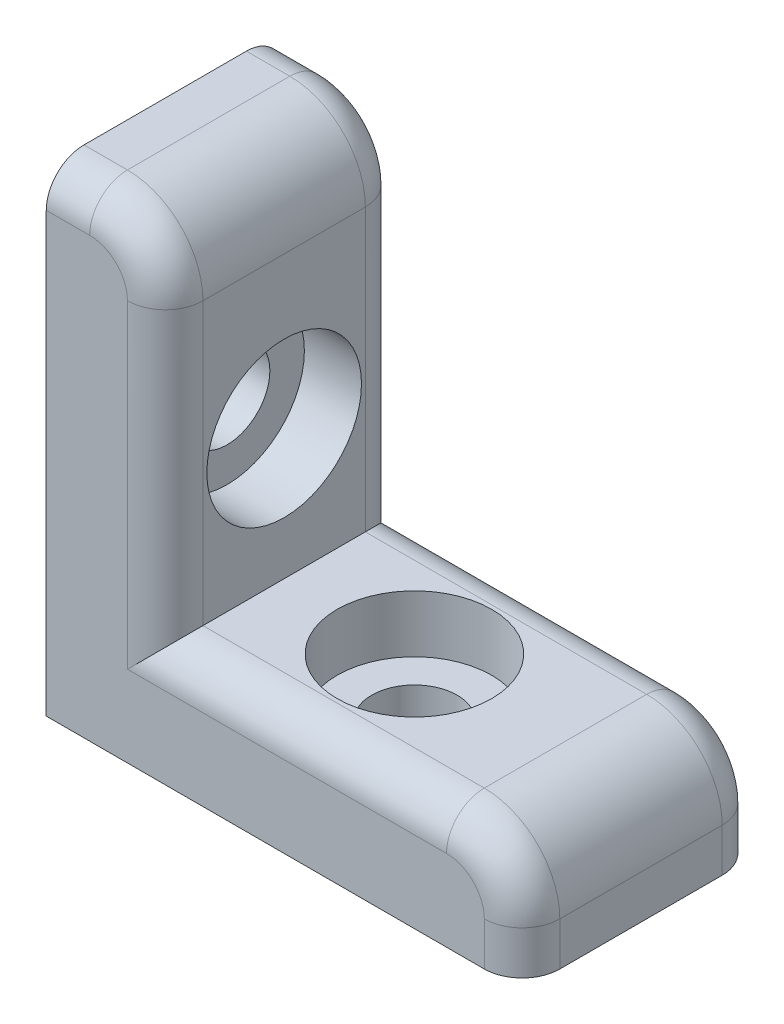
ISO-10303-21;
HEADER;
FILE_DESCRIPTION(('STEP AP214'),'2;1');
FILE_NAME('part.step','',(''),(''),'','','');
FILE_SCHEMA(('AUTOMOTIVE_DESIGN { 1 0 10303 214 1 1 1 1 }'));
ENDSEC;
DATA;
#1=APPLICATION_CONTEXT('core data for automotive mechanical design processes');
#2=APPLICATION_PROTOCOL_DEFINITION('international standard','automotive_design',2000,#1);
#3=PRODUCT_CONTEXT('',#1,'mechanical');
#4=PRODUCT('Part','Part','',(#3));
#5=PRODUCT_RELATED_PRODUCT_CATEGORY('part','',(#4));
#6=PRODUCT_DEFINITION_FORMATION('','',#4);
#7=PRODUCT_DEFINITION_CONTEXT('part definition',#1,'design');
#8=PRODUCT_DEFINITION('design','',#6,#7);
#9=PRODUCT_DEFINITION_SHAPE('','',#8);
#10=(LENGTH_UNIT() NAMED_UNIT(*) SI_UNIT(.MILLI.,.METRE.));
#11=(NAMED_UNIT(*) PLANE_ANGLE_UNIT() SI_UNIT($,.RADIAN.));
#12=(NAMED_UNIT(*) SI_UNIT($,.STERADIAN.) SOLID_ANGLE_UNIT());
#13=UNCERTAINTY_MEASURE_WITH_UNIT(LENGTH_MEASURE(1.E-05),#10,'distance_accuracy_value','');
#14=(GEOMETRIC_REPRESENTATION_CONTEXT(3) GLOBAL_UNCERTAINTY_ASSIGNED_CONTEXT((#13)) GLOBAL_UNIT_ASSIGNED_CONTEXT((#10,
#11,#12)) REPRESENTATION_CONTEXT('',''));
#15=CARTESIAN_POINT('',(0.,0.,0.));
#16=DIRECTION('',(0.,0.,1.));
#17=DIRECTION('',(1.,0.,0.));
#18=AXIS2_PLACEMENT_3D('',#15,#16,#17);
#19=CARTESIAN_POINT('',(0.,20.,5.));
#20=DIRECTION('',(1.,0.,0.));
#21=DIRECTION('',(0.,0.,-1.));
#22=AXIS2_PLACEMENT_3D('',#19,#20,#21);
#23=PLANE('',#22);
#24=CARTESIAN_POINT('',(0.,10.475,0.));
#25=DIRECTION('',(1.,0.,0.));
#26=DIRECTION('',(0.,0.,-1.));
#27=AXIS2_PLACEMENT_3D('',#24,#25,#26);
#28=CIRCLE('',#27,1.80000000000001);
#29=CARTESIAN_POINT('',(0.,10.475,-1.80000000000001));
#30=VERTEX_POINT('',#29);
#31=EDGE_CURVE('E346',#30,#30,#28,.T.);
#32=ORIENTED_EDGE('',*,*,#31,.T.);
#33=EDGE_LOOP('',(#32));
#34=FACE_BOUND('',#33,.T.);
#35=DIRECTION('',(0.,0.,-1.));
#36=VECTOR('',#35,1.);
#37=CARTESIAN_POINT('',(0.,20.,5.));
#38=LINE('',#37,#36);
#39=CARTESIAN_POINT('',(0.,20.,3.4125));
#40=VERTEX_POINT('',#39);
#41=CARTESIAN_POINT('',(0.,20.,-3.4125));
#42=VERTEX_POINT('',#41);
#43=EDGE_CURVE('E178',#40,#42,#38,.T.);
#44=ORIENTED_EDGE('',*,*,#43,.T.);
#45=CARTESIAN_POINT('',(0.,18.4125,-3.4125));
#46=DIRECTION('',(1.,0.,0.));
#47=DIRECTION('',(0.,0.,-1.));
#48=AXIS2_PLACEMENT_3D('',#45,#46,#47);
#49=CIRCLE('',#48,1.5875);
#50=CARTESIAN_POINT('',(0.,18.4125,-5.));
#51=VERTEX_POINT('',#50);
#52=EDGE_CURVE('E254',#42,#51,#49,.F.);
#53=ORIENTED_EDGE('',*,*,#52,.T.);
#54=DIRECTION('',(0.,-1.,0.));
#55=VECTOR('',#54,1.);
#56=CARTESIAN_POINT('',(0.,20.,-5.));
#57=LINE('',#56,#55);
#58=CARTESIAN_POINT('',(0.,0.,-5.));
#59=VERTEX_POINT('',#58);
#60=EDGE_CURVE('E182',#51,#59,#57,.T.);
#61=ORIENTED_EDGE('',*,*,#60,.T.);
#62=DIRECTION('',(0.,0.,-1.));
#63=VECTOR('',#62,1.);
#64=CARTESIAN_POINT('',(0.,0.,5.));
#65=LINE('',#64,#63);
#66=CARTESIAN_POINT('',(0.,0.,5.));
#67=VERTEX_POINT('',#66);
#68=EDGE_CURVE('E173',#67,#59,#65,.T.);
#69=ORIENTED_EDGE('',*,*,#68,.F.);
#70=DIRECTION('',(0.,-1.,0.));
#71=VECTOR('',#70,1.);
#72=CARTESIAN_POINT('',(0.,20.,5.));
#73=LINE('',#72,#71);
#74=CARTESIAN_POINT('',(0.,18.4125,5.));
#75=VERTEX_POINT('',#74);
#76=EDGE_CURVE('E157',#75,#67,#73,.T.);
#77=ORIENTED_EDGE('',*,*,#76,.F.);
#78=CARTESIAN_POINT('',(0.,18.4125,3.4125));
#79=DIRECTION('',(1.,0.,0.));
#80=DIRECTION('',(0.,0.,-1.));
#81=AXIS2_PLACEMENT_3D('',#78,#79,#80);
#82=CIRCLE('',#81,1.5875);
#83=EDGE_CURVE('E251',#75,#40,#82,.F.);
#84=ORIENTED_EDGE('',*,*,#83,.T.);
#85=EDGE_LOOP('',(#44,#53,#61,#69,#77,#84));
#86=FACE_BOUND('',#85,.T.);
#87=ADVANCED_FACE('F47',(#34,#86),#23,.F.);
#88=CARTESIAN_POINT('',(0.,0.,5.));
#89=DIRECTION('',(0.,1.,0.));
#90=DIRECTION('',(0.,0.,1.));
#91=AXIS2_PLACEMENT_3D('',#88,#89,#90);
#92=PLANE('',#91);
#93=CARTESIAN_POINT('',(10.475,0.,0.));
#94=DIRECTION('',(0.,1.,0.));
#95=DIRECTION('',(0.,0.,1.));
#96=AXIS2_PLACEMENT_3D('',#93,#94,#95);
#97=CIRCLE('',#96,1.80000000000001);
#98=CARTESIAN_POINT('',(10.475,0.,1.80000000000001));
#99=VERTEX_POINT('',#98);
#100=EDGE_CURVE('E363',#99,#99,#97,.T.);
#101=ORIENTED_EDGE('',*,*,#100,.T.);
#102=EDGE_LOOP('',(#101));
#103=FACE_BOUND('',#102,.T.);
#104=DIRECTION('',(1.,0.,0.));
#105=VECTOR('',#104,1.);
#106=CARTESIAN_POINT('',(0.,0.,-5.));
#107=LINE('',#106,#105);
#108=CARTESIAN_POINT('',(18.4125,0.,-5.));
#109=VERTEX_POINT('',#108);
#110=EDGE_CURVE('E167',#59,#109,#107,.T.);
#111=ORIENTED_EDGE('',*,*,#110,.T.);
#112=CARTESIAN_POINT('',(18.4125,0.,-3.4125));
#113=DIRECTION('',(0.,1.,0.));
#114=DIRECTION('',(0.,0.,1.));
#115=AXIS2_PLACEMENT_3D('',#112,#113,#114);
#116=CIRCLE('',#115,1.5875);
#117=CARTESIAN_POINT('',(20.,0.,-3.4125));
#118=VERTEX_POINT('',#117);
#119=EDGE_CURVE('E242',#109,#118,#116,.F.);
#120=ORIENTED_EDGE('',*,*,#119,.T.);
#121=DIRECTION('',(0.,0.,-1.));
#122=VECTOR('',#121,1.);
#123=CARTESIAN_POINT('',(20.,0.,5.));
#124=LINE('',#123,#122);
#125=CARTESIAN_POINT('',(20.,0.,3.4125));
#126=VERTEX_POINT('',#125);
#127=EDGE_CURVE('E186',#126,#118,#124,.T.);
#128=ORIENTED_EDGE('',*,*,#127,.F.);
#129=CARTESIAN_POINT('',(18.4125,0.,3.4125));
#130=DIRECTION('',(0.,1.,0.));
#131=DIRECTION('',(0.,0.,1.));
#132=AXIS2_PLACEMENT_3D('',#129,#130,#131);
#133=CIRCLE('',#132,1.5875);
#134=CARTESIAN_POINT('',(18.4125,0.,5.));
#135=VERTEX_POINT('',#134);
#136=EDGE_CURVE('E176',#126,#135,#133,.F.);
#137=ORIENTED_EDGE('',*,*,#136,.T.);
#138=DIRECTION('',(1.,0.,0.));
#139=VECTOR('',#138,1.);
#140=CARTESIAN_POINT('',(0.,0.,5.));
#141=LINE('',#140,#139);
#142=EDGE_CURVE('E160',#67,#135,#141,.T.);
#143=ORIENTED_EDGE('',*,*,#142,.F.);
#144=ORIENTED_EDGE('',*,*,#68,.T.);
#145=EDGE_LOOP('',(#111,#120,#128,#137,#143,#144));
#146=FACE_BOUND('',#145,.T.);
#147=ADVANCED_FACE('F172',(#103,#146),#92,.F.);
#148=CARTESIAN_POINT('',(20.,5.,5.));
#149=DIRECTION('',(-1.,0.,0.));
#150=DIRECTION('',(0.,0.,1.));
#151=AXIS2_PLACEMENT_3D('',#148,#149,#150);
#152=PLANE('',#151);
#153=ORIENTED_EDGE('',*,*,#127,.T.);
#154=DIRECTION('',(0.,1.,0.));
#155=VECTOR('',#154,1.);
#156=CARTESIAN_POINT('',(20.,5.,-3.4125));
#157=LINE('',#156,#155);
#158=CARTESIAN_POINT('',(20.,1.825,-3.4125));
#159=VERTEX_POINT('',#158);
#160=EDGE_CURVE('E237',#118,#159,#157,.T.);
#161=ORIENTED_EDGE('',*,*,#160,.T.);
#162=DIRECTION('',(0.,0.,-1.));
#163=VECTOR('',#162,1.);
#164=CARTESIAN_POINT('',(20.,1.825,5.));
#165=LINE('',#164,#163);
#166=CARTESIAN_POINT('',(20.,1.825,3.4125));
#167=VERTEX_POINT('',#166);
#168=EDGE_CURVE('E191',#159,#167,#165,.F.);
#169=ORIENTED_EDGE('',*,*,#168,.T.);
#170=DIRECTION('',(0.,1.,0.));
#171=VECTOR('',#170,1.);
#172=CARTESIAN_POINT('',(20.,0.,3.4125));
#173=LINE('',#172,#171);
#174=EDGE_CURVE('E234',#167,#126,#173,.F.);
#175=ORIENTED_EDGE('',*,*,#174,.T.);
#176=EDGE_LOOP('',(#153,#161,#169,#175));
#177=FACE_BOUND('',#176,.T.);
#178=ADVANCED_FACE('F385',(#177),#152,.F.);
#179=CARTESIAN_POINT('',(5.,5.,5.));
#180=DIRECTION('',(0.,-1.,0.));
#181=DIRECTION('',(0.,0.,-1.));
#182=AXIS2_PLACEMENT_3D('',#179,#180,#181);
#183=PLANE('',#182);
#184=CARTESIAN_POINT('',(10.475,5.,0.));
#185=DIRECTION('',(0.,1.,0.));
#186=DIRECTION('',(0.,0.,1.));
#187=AXIS2_PLACEMENT_3D('',#184,#185,#186);
#188=CIRCLE('',#187,3.25);
#189=CARTESIAN_POINT('',(10.475,5.,3.25));
#190=VERTEX_POINT('',#189);
#191=EDGE_CURVE('E306',#190,#190,#188,.T.);
#192=ORIENTED_EDGE('',*,*,#191,.F.);
#193=EDGE_LOOP('',(#192));
#194=FACE_BOUND('',#193,.T.);
#195=DIRECTION('',(0.,0.,-1.));
#196=VECTOR('',#195,1.);
#197=CARTESIAN_POINT('',(16.825,5.,5.));
#198=LINE('',#197,#196);
#199=CARTESIAN_POINT('',(16.825,5.,3.4125));
#200=VERTEX_POINT('',#199);
#201=CARTESIAN_POINT('',(16.825,5.,-3.4125));
#202=VERTEX_POINT('',#201);
#203=EDGE_CURVE('E185',#200,#202,#198,.T.);
#204=ORIENTED_EDGE('',*,*,#203,.T.);
#205=DIRECTION('',(-1.,0.,0.));
#206=VECTOR('',#205,1.);
#207=CARTESIAN_POINT('',(5.,5.,-3.4125));
#208=LINE('',#207,#206);
#209=CARTESIAN_POINT('',(5.,5.,-3.4125));
#210=VERTEX_POINT('',#209);
#211=EDGE_CURVE('E212',#202,#210,#208,.T.);
#212=ORIENTED_EDGE('',*,*,#211,.T.);
#213=DIRECTION('',(0.,0.,-1.));
#214=VECTOR('',#213,1.);
#215=CARTESIAN_POINT('',(5.,5.,5.));
#216=LINE('',#215,#214);
#217=CARTESIAN_POINT('',(5.,5.,3.4125));
#218=VERTEX_POINT('',#217);
#219=EDGE_CURVE('E194',#218,#210,#216,.T.);
#220=ORIENTED_EDGE('',*,*,#219,.F.);
#221=DIRECTION('',(-1.,0.,0.));
#222=VECTOR('',#221,1.);
#223=CARTESIAN_POINT('',(16.825,5.,3.4125));
#224=LINE('',#223,#222);
#225=EDGE_CURVE('E209',#218,#200,#224,.F.);
#226=ORIENTED_EDGE('',*,*,#225,.T.);
#227=EDGE_LOOP('',(#204,#212,#220,#226));
#228=FACE_BOUND('',#227,.T.);
#229=ADVANCED_FACE('F381',(#194,#228),#183,.F.);
#230=CARTESIAN_POINT('',(5.,20.,5.));
#231=DIRECTION('',(-1.,0.,0.));
#232=DIRECTION('',(0.,-1.,0.));
#233=AXIS2_PLACEMENT_3D('',#230,#231,#232);
#234=PLANE('',#233);
#235=CARTESIAN_POINT('',(5.,10.475,0.));
#236=DIRECTION('',(1.,0.,0.));
#237=DIRECTION('',(0.,0.,-1.));
#238=AXIS2_PLACEMENT_3D('',#235,#236,#237);
#239=CIRCLE('',#238,3.25);
#240=CARTESIAN_POINT('',(5.,10.475,-3.25));
#241=VERTEX_POINT('',#240);
#242=EDGE_CURVE('E359',#241,#241,#239,.T.);
#243=ORIENTED_EDGE('',*,*,#242,.F.);
#244=EDGE_LOOP('',(#243));
#245=FACE_BOUND('',#244,.T.);
#246=ORIENTED_EDGE('',*,*,#219,.T.);
#247=DIRECTION('',(0.,1.,0.));
#248=VECTOR('',#247,1.);
#249=CARTESIAN_POINT('',(5.,20.,-3.4125));
#250=LINE('',#249,#248);
#251=CARTESIAN_POINT('',(5.,16.825,-3.4125));
#252=VERTEX_POINT('',#251);
#253=EDGE_CURVE('E260',#210,#252,#250,.T.);
#254=ORIENTED_EDGE('',*,*,#253,.T.);
#255=DIRECTION('',(0.,0.,-1.));
#256=VECTOR('',#255,1.);
#257=CARTESIAN_POINT('',(5.,16.825,5.));
#258=LINE('',#257,#256);
#259=CARTESIAN_POINT('',(5.,16.825,3.4125));
#260=VERTEX_POINT('',#259);
#261=EDGE_CURVE('E205',#252,#260,#258,.F.);
#262=ORIENTED_EDGE('',*,*,#261,.T.);
#263=DIRECTION('',(0.,1.,0.));
#264=VECTOR('',#263,1.);
#265=CARTESIAN_POINT('',(5.,5.,3.4125));
#266=LINE('',#265,#264);
#267=EDGE_CURVE('E257',#260,#218,#266,.F.);
#268=ORIENTED_EDGE('',*,*,#267,.T.);
#269=EDGE_LOOP('',(#246,#254,#262,#268));
#270=FACE_BOUND('',#269,.T.);
#271=ADVANCED_FACE('F384',(#245,#270),#234,.F.);
#272=CARTESIAN_POINT('',(0.,20.,5.));
#273=DIRECTION('',(0.,-1.,0.));
#274=DIRECTION('',(0.,0.,-1.));
#275=AXIS2_PLACEMENT_3D('',#272,#273,#274);
#276=PLANE('',#275);
#277=DIRECTION('',(0.,0.,-1.));
#278=VECTOR('',#277,1.);
#279=CARTESIAN_POINT('',(1.825,20.,5.));
#280=LINE('',#279,#278);
#281=CARTESIAN_POINT('',(1.825,20.,3.4125));
#282=VERTEX_POINT('',#281);
#283=CARTESIAN_POINT('',(1.825,20.,-3.4125));
#284=VERTEX_POINT('',#283);
#285=EDGE_CURVE('E201',#282,#284,#280,.T.);
#286=ORIENTED_EDGE('',*,*,#285,.T.);
#287=DIRECTION('',(-1.,0.,0.));
#288=VECTOR('',#287,1.);
#289=CARTESIAN_POINT('',(0.,20.,-3.4125));
#290=LINE('',#289,#288);
#291=EDGE_CURVE('E248',#284,#42,#290,.T.);
#292=ORIENTED_EDGE('',*,*,#291,.T.);
#293=ORIENTED_EDGE('',*,*,#43,.F.);
#294=DIRECTION('',(-1.,0.,0.));
#295=VECTOR('',#294,1.);
#296=CARTESIAN_POINT('',(1.825,20.,3.4125));
#297=LINE('',#296,#295);
#298=EDGE_CURVE('E245',#40,#282,#297,.F.);
#299=ORIENTED_EDGE('',*,*,#298,.T.);
#300=EDGE_LOOP('',(#286,#292,#293,#299));
#301=FACE_BOUND('',#300,.T.);
#302=ADVANCED_FACE('F335',(#301),#276,.F.);
#303=CARTESIAN_POINT('',(0.,0.,5.));
#304=DIRECTION('',(0.,0.,1.));
#305=DIRECTION('',(1.,0.,0.));
#306=AXIS2_PLACEMENT_3D('',#303,#304,#305);
#307=PLANE('',#306);
#308=ORIENTED_EDGE('',*,*,#142,.T.);
#309=DIRECTION('',(0.,1.,0.));
#310=VECTOR('',#309,1.);
#311=CARTESIAN_POINT('',(18.4125,1.825,5.));
#312=LINE('',#311,#310);
#313=CARTESIAN_POINT('',(18.4125,1.825,5.));
#314=VERTEX_POINT('',#313);
#315=EDGE_CURVE('E276',#135,#314,#312,.T.);
#316=ORIENTED_EDGE('',*,*,#315,.T.);
#317=CARTESIAN_POINT('',(16.825,1.825,5.));
#318=DIRECTION('',(0.,0.,1.));
#319=DIRECTION('',(1.,0.,0.));
#320=AXIS2_PLACEMENT_3D('',#317,#318,#319);
#321=CIRCLE('',#320,1.5875);
#322=CARTESIAN_POINT('',(16.825,3.4125,5.));
#323=VERTEX_POINT('',#322);
#324=EDGE_CURVE('E72',#314,#323,#321,.T.);
#325=ORIENTED_EDGE('',*,*,#324,.T.);
#326=DIRECTION('',(-1.,0.,0.));
#327=VECTOR('',#326,1.);
#328=CARTESIAN_POINT('',(5.,3.4125,5.));
#329=LINE('',#328,#327);
#330=CARTESIAN_POINT('',(3.4125,3.4125,5.));
#331=VERTEX_POINT('',#330);
#332=EDGE_CURVE('E271',#323,#331,#329,.T.);
#333=ORIENTED_EDGE('',*,*,#332,.T.);
#334=DIRECTION('',(0.,1.,0.));
#335=VECTOR('',#334,1.);
#336=CARTESIAN_POINT('',(3.4125,16.825,5.));
#337=LINE('',#336,#335);
#338=CARTESIAN_POINT('',(3.4125,16.825,5.));
#339=VERTEX_POINT('',#338);
#340=EDGE_CURVE('E268',#331,#339,#337,.T.);
#341=ORIENTED_EDGE('',*,*,#340,.T.);
#342=CARTESIAN_POINT('',(1.825,16.825,5.));
#343=DIRECTION('',(0.,0.,1.));
#344=DIRECTION('',(1.,0.,0.));
#345=AXIS2_PLACEMENT_3D('',#342,#343,#344);
#346=CIRCLE('',#345,1.5875);
#347=CARTESIAN_POINT('',(1.825,18.4125,5.));
#348=VERTEX_POINT('',#347);
#349=EDGE_CURVE('E263',#339,#348,#346,.T.);
#350=ORIENTED_EDGE('',*,*,#349,.T.);
#351=DIRECTION('',(-1.,0.,0.));
#352=VECTOR('',#351,1.);
#353=CARTESIAN_POINT('',(0.,18.4125,5.));
#354=LINE('',#353,#352);
#355=EDGE_CURVE('E162',#348,#75,#354,.T.);
#356=ORIENTED_EDGE('',*,*,#355,.T.);
#357=ORIENTED_EDGE('',*,*,#76,.T.);
#358=EDGE_LOOP('',(#308,#316,#325,#333,#341,#350,#356,#357));
#359=FACE_BOUND('',#358,.T.);
#360=ADVANCED_FACE('F159',(#359),#307,.T.);
#361=CARTESIAN_POINT('',(0.,0.,-5.));
#362=DIRECTION('',(0.,0.,1.));
#363=DIRECTION('',(1.,0.,0.));
#364=AXIS2_PLACEMENT_3D('',#361,#362,#363);
#365=PLANE('',#364);
#366=CARTESIAN_POINT('',(16.825,1.825,-5.));
#367=DIRECTION('',(0.,0.,1.));
#368=DIRECTION('',(1.,0.,0.));
#369=AXIS2_PLACEMENT_3D('',#366,#367,#368);
#370=CIRCLE('',#369,1.5875);
#371=CARTESIAN_POINT('',(16.825,3.4125,-5.));
#372=VERTEX_POINT('',#371);
#373=CARTESIAN_POINT('',(18.4125,1.825,-5.));
#374=VERTEX_POINT('',#373);
#375=EDGE_CURVE('E228',#372,#374,#370,.F.);
#376=ORIENTED_EDGE('',*,*,#375,.T.);
#377=DIRECTION('',(0.,1.,0.));
#378=VECTOR('',#377,1.);
#379=CARTESIAN_POINT('',(18.4125,0.,-5.));
#380=LINE('',#379,#378);
#381=EDGE_CURVE('E231',#374,#109,#380,.F.);
#382=ORIENTED_EDGE('',*,*,#381,.T.);
#383=ORIENTED_EDGE('',*,*,#110,.F.);
#384=ORIENTED_EDGE('',*,*,#60,.F.);
#385=DIRECTION('',(-1.,0.,0.));
#386=VECTOR('',#385,1.);
#387=CARTESIAN_POINT('',(0.,18.4125,-5.));
#388=LINE('',#387,#386);
#389=CARTESIAN_POINT('',(1.825,18.4125,-5.));
#390=VERTEX_POINT('',#389);
#391=EDGE_CURVE('E222',#51,#390,#388,.F.);
#392=ORIENTED_EDGE('',*,*,#391,.T.);
#393=CARTESIAN_POINT('',(1.825,16.825,-5.));
#394=DIRECTION('',(0.,0.,1.));
#395=DIRECTION('',(1.,0.,0.));
#396=AXIS2_PLACEMENT_3D('',#393,#394,#395);
#397=CIRCLE('',#396,1.5875);
#398=CARTESIAN_POINT('',(3.4125,16.825,-5.));
#399=VERTEX_POINT('',#398);
#400=EDGE_CURVE('E216',#390,#399,#397,.F.);
#401=ORIENTED_EDGE('',*,*,#400,.T.);
#402=DIRECTION('',(0.,1.,0.));
#403=VECTOR('',#402,1.);
#404=CARTESIAN_POINT('',(3.4125,0.,-5.));
#405=LINE('',#404,#403);
#406=CARTESIAN_POINT('',(3.4125,3.4125,-5.));
#407=VERTEX_POINT('',#406);
#408=EDGE_CURVE('E219',#399,#407,#405,.F.);
#409=ORIENTED_EDGE('',*,*,#408,.T.);
#410=DIRECTION('',(-1.,0.,0.));
#411=VECTOR('',#410,1.);
#412=CARTESIAN_POINT('',(0.,3.4125,-5.));
#413=LINE('',#412,#411);
#414=EDGE_CURVE('E225',#407,#372,#413,.F.);
#415=ORIENTED_EDGE('',*,*,#414,.T.);
#416=EDGE_LOOP('',(#376,#382,#383,#384,#392,#401,#409,#415));
#417=FACE_BOUND('',#416,.T.);
#418=ADVANCED_FACE('F420',(#417),#365,.F.);
#419=CARTESIAN_POINT('',(5.,10.475,0.));
#420=DIRECTION('',(1.,0.,0.));
#421=DIRECTION('',(0.,0.,-1.));
#422=AXIS2_PLACEMENT_3D('',#419,#420,#421);
#423=CYLINDRICAL_SURFACE('',#422,1.80000000000001);
#424=ORIENTED_EDGE('',*,*,#31,.F.);
#425=EDGE_LOOP('',(#424));
#426=FACE_BOUND('',#425,.T.);
#427=CARTESIAN_POINT('',(2.6,10.475,0.));
#428=DIRECTION('',(1.,0.,0.));
#429=DIRECTION('',(0.,0.,-1.));
#430=AXIS2_PLACEMENT_3D('',#427,#428,#429);
#431=CIRCLE('',#430,1.8);
#432=CARTESIAN_POINT('',(2.6,10.475,-1.8));
#433=VERTEX_POINT('',#432);
#434=EDGE_CURVE('E351',#433,#433,#431,.T.);
#435=ORIENTED_EDGE('',*,*,#434,.T.);
#436=EDGE_LOOP('',(#435));
#437=FACE_BOUND('',#436,.T.);
#438=ADVANCED_FACE('F604',(#426,#437),#423,.F.);
#439=CARTESIAN_POINT('',(2.6,12.275,0.));
#440=DIRECTION('',(-1.,0.,0.));
#441=DIRECTION('',(0.,0.,1.));
#442=AXIS2_PLACEMENT_3D('',#439,#440,#441);
#443=PLANE('',#442);
#444=ORIENTED_EDGE('',*,*,#434,.F.);
#445=EDGE_LOOP('',(#444));
#446=FACE_BOUND('',#445,.T.);
#447=CARTESIAN_POINT('',(2.6,10.475,0.));
#448=DIRECTION('',(1.,0.,0.));
#449=DIRECTION('',(0.,0.,-1.));
#450=AXIS2_PLACEMENT_3D('',#447,#448,#449);
#451=CIRCLE('',#450,3.25);
#452=CARTESIAN_POINT('',(2.6,10.475,-3.25));
#453=VERTEX_POINT('',#452);
#454=EDGE_CURVE('E355',#453,#453,#451,.T.);
#455=ORIENTED_EDGE('',*,*,#454,.T.);
#456=EDGE_LOOP('',(#455));
#457=FACE_BOUND('',#456,.T.);
#458=ADVANCED_FACE('F595',(#446,#457),#443,.F.);
#459=CARTESIAN_POINT('',(5.,10.475,0.));
#460=DIRECTION('',(1.,0.,0.));
#461=DIRECTION('',(0.,0.,-1.));
#462=AXIS2_PLACEMENT_3D('',#459,#460,#461);
#463=CYLINDRICAL_SURFACE('',#462,3.25);
#464=ORIENTED_EDGE('',*,*,#454,.F.);
#465=EDGE_LOOP('',(#464));
#466=FACE_BOUND('',#465,.T.);
#467=ORIENTED_EDGE('',*,*,#242,.T.);
#468=EDGE_LOOP('',(#467));
#469=FACE_BOUND('',#468,.T.);
#470=ADVANCED_FACE('F586',(#466,#469),#463,.F.);
#471=CARTESIAN_POINT('',(10.475,5.,0.));
#472=DIRECTION('',(0.,1.,0.));
#473=DIRECTION('',(0.,0.,1.));
#474=AXIS2_PLACEMENT_3D('',#471,#472,#473);
#475=CYLINDRICAL_SURFACE('',#474,1.80000000000001);
#476=ORIENTED_EDGE('',*,*,#100,.F.);
#477=EDGE_LOOP('',(#476));
#478=FACE_BOUND('',#477,.T.);
#479=CARTESIAN_POINT('',(10.475,2.6,0.));
#480=DIRECTION('',(0.,1.,0.));
#481=DIRECTION('',(0.,0.,1.));
#482=AXIS2_PLACEMENT_3D('',#479,#480,#481);
#483=CIRCLE('',#482,1.80000000000001);
#484=CARTESIAN_POINT('',(10.475,2.6,1.80000000000001));
#485=VERTEX_POINT('',#484);
#486=EDGE_CURVE('E367',#485,#485,#483,.T.);
#487=ORIENTED_EDGE('',*,*,#486,.T.);
#488=EDGE_LOOP('',(#487));
#489=FACE_BOUND('',#488,.T.);
#490=ADVANCED_FACE('F577',(#478,#489),#475,.F.);
#491=CARTESIAN_POINT('',(12.275,2.6,0.));
#492=DIRECTION('',(0.,-1.,0.));
#493=DIRECTION('',(0.,0.,-1.));
#494=AXIS2_PLACEMENT_3D('',#491,#492,#493);
#495=PLANE('',#494);
#496=ORIENTED_EDGE('',*,*,#486,.F.);
#497=EDGE_LOOP('',(#496));
#498=FACE_BOUND('',#497,.T.);
#499=CARTESIAN_POINT('',(10.475,2.6,0.));
#500=DIRECTION('',(0.,1.,0.));
#501=DIRECTION('',(0.,0.,1.));
#502=AXIS2_PLACEMENT_3D('',#499,#500,#501);
#503=CIRCLE('',#502,3.25);
#504=CARTESIAN_POINT('',(10.475,2.6,3.25));
#505=VERTEX_POINT('',#504);
#506=EDGE_CURVE('E371',#505,#505,#503,.T.);
#507=ORIENTED_EDGE('',*,*,#506,.T.);
#508=EDGE_LOOP('',(#507));
#509=FACE_BOUND('',#508,.T.);
#510=ADVANCED_FACE('F568',(#498,#509),#495,.F.);
#511=CARTESIAN_POINT('',(10.475,5.,0.));
#512=DIRECTION('',(0.,1.,0.));
#513=DIRECTION('',(0.,0.,1.));
#514=AXIS2_PLACEMENT_3D('',#511,#512,#513);
#515=CYLINDRICAL_SURFACE('',#514,3.25);
#516=ORIENTED_EDGE('',*,*,#506,.F.);
#517=EDGE_LOOP('',(#516));
#518=FACE_BOUND('',#517,.T.);
#519=ORIENTED_EDGE('',*,*,#191,.T.);
#520=EDGE_LOOP('',(#519));
#521=FACE_BOUND('',#520,.T.);
#522=ADVANCED_FACE('F379',(#518,#521),#515,.F.);
#523=CARTESIAN_POINT('',(16.825,1.825,5.));
#524=DIRECTION('',(0.,0.,-1.));
#525=DIRECTION('',(-1.,0.,0.));
#526=AXIS2_PLACEMENT_3D('',#523,#524,#525);
#527=CYLINDRICAL_SURFACE('',#526,3.175);
#528=ORIENTED_EDGE('',*,*,#168,.F.);
#529=CARTESIAN_POINT('',(16.825,1.825,-3.4125));
#530=DIRECTION('',(0.,0.,1.));
#531=DIRECTION('',(1.,0.,0.));
#532=AXIS2_PLACEMENT_3D('',#529,#530,#531);
#533=CIRCLE('',#532,3.175);
#534=EDGE_CURVE('E282',#159,#202,#533,.T.);
#535=ORIENTED_EDGE('',*,*,#534,.T.);
#536=ORIENTED_EDGE('',*,*,#203,.F.);
#537=CARTESIAN_POINT('',(16.825,1.825,3.4125));
#538=DIRECTION('',(0.,0.,1.));
#539=DIRECTION('',(1.,0.,0.));
#540=AXIS2_PLACEMENT_3D('',#537,#538,#539);
#541=CIRCLE('',#540,3.175);
#542=EDGE_CURVE('E279',#200,#167,#541,.F.);
#543=ORIENTED_EDGE('',*,*,#542,.T.);
#544=EDGE_LOOP('',(#528,#535,#536,#543));
#545=FACE_BOUND('',#544,.T.);
#546=ADVANCED_FACE('F429',(#545),#527,.T.);
#547=CARTESIAN_POINT('',(1.825,16.825,5.));
#548=DIRECTION('',(0.,0.,-1.));
#549=DIRECTION('',(-1.,0.,0.));
#550=AXIS2_PLACEMENT_3D('',#547,#548,#549);
#551=CYLINDRICAL_SURFACE('',#550,3.175);
#552=ORIENTED_EDGE('',*,*,#261,.F.);
#553=CARTESIAN_POINT('',(1.825,16.825,-3.4125));
#554=DIRECTION('',(0.,0.,1.));
#555=DIRECTION('',(1.,0.,0.));
#556=AXIS2_PLACEMENT_3D('',#553,#554,#555);
#557=CIRCLE('',#556,3.175);
#558=EDGE_CURVE('E11',#252,#284,#557,.T.);
#559=ORIENTED_EDGE('',*,*,#558,.T.);
#560=ORIENTED_EDGE('',*,*,#285,.F.);
#561=CARTESIAN_POINT('',(1.825,16.825,3.4125));
#562=DIRECTION('',(0.,0.,1.));
#563=DIRECTION('',(1.,0.,0.));
#564=AXIS2_PLACEMENT_3D('',#561,#562,#563);
#565=CIRCLE('',#564,3.175);
#566=EDGE_CURVE('E57',#282,#260,#565,.F.);
#567=ORIENTED_EDGE('',*,*,#566,.T.);
#568=EDGE_LOOP('',(#552,#559,#560,#567));
#569=FACE_BOUND('',#568,.T.);
#570=ADVANCED_FACE('F411',(#569),#551,.T.);
#571=CARTESIAN_POINT('',(0.,18.4125,-3.4125));
#572=DIRECTION('',(-1.,0.,0.));
#573=DIRECTION('',(0.,0.,1.));
#574=AXIS2_PLACEMENT_3D('',#571,#572,#573);
#575=CYLINDRICAL_SURFACE('',#574,1.5875);
#576=ORIENTED_EDGE('',*,*,#52,.F.);
#577=ORIENTED_EDGE('',*,*,#291,.F.);
#578=CARTESIAN_POINT('',(1.825,18.4125,-3.4125));
#579=DIRECTION('',(1.,0.,0.));
#580=DIRECTION('',(0.,0.,-1.));
#581=AXIS2_PLACEMENT_3D('',#578,#579,#580);
#582=CIRCLE('',#581,1.5875);
#583=EDGE_CURVE('E302',#390,#284,#582,.T.);
#584=ORIENTED_EDGE('',*,*,#583,.F.);
#585=ORIENTED_EDGE('',*,*,#391,.F.);
#586=EDGE_LOOP('',(#576,#577,#584,#585));
#587=FACE_BOUND('',#586,.T.);
#588=ADVANCED_FACE('F418',(#587),#575,.T.);
#589=CARTESIAN_POINT('',(18.4125,5.,-3.4125));
#590=DIRECTION('',(0.,1.,0.));
#591=DIRECTION('',(0.,0.,1.));
#592=AXIS2_PLACEMENT_3D('',#589,#590,#591);
#593=CYLINDRICAL_SURFACE('',#592,1.5875);
#594=ORIENTED_EDGE('',*,*,#119,.F.);
#595=ORIENTED_EDGE('',*,*,#381,.F.);
#596=CARTESIAN_POINT('',(18.4125,1.825,-3.4125));
#597=DIRECTION('',(0.,1.,0.));
#598=DIRECTION('',(0.,0.,1.));
#599=AXIS2_PLACEMENT_3D('',#596,#597,#598);
#600=CIRCLE('',#599,1.5875);
#601=EDGE_CURVE('E298',#159,#374,#600,.T.);
#602=ORIENTED_EDGE('',*,*,#601,.F.);
#603=ORIENTED_EDGE('',*,*,#160,.F.);
#604=EDGE_LOOP('',(#594,#595,#602,#603));
#605=FACE_BOUND('',#604,.T.);
#606=ADVANCED_FACE('F425',(#605),#593,.T.);
#607=CARTESIAN_POINT('',(1.825,16.825,-3.4125));
#608=DIRECTION('',(0.,0.,1.));
#609=DIRECTION('',(1.,0.,0.));
#610=AXIS2_PLACEMENT_3D('',#607,#608,#609);
#611=DEGENERATE_TOROIDAL_SURFACE('',#610,1.5875,1.5875,.T.);
#612=ORIENTED_EDGE('',*,*,#583,.T.);
#613=ORIENTED_EDGE('',*,*,#558,.F.);
#614=CARTESIAN_POINT('',(3.4125,16.825,-3.4125));
#615=DIRECTION('',(0.,-1.,0.));
#616=DIRECTION('',(0.,0.,-1.));
#617=AXIS2_PLACEMENT_3D('',#614,#615,#616);
#618=CIRCLE('',#617,1.5875);
#619=EDGE_CURVE('E294',#399,#252,#618,.T.);
#620=ORIENTED_EDGE('',*,*,#619,.F.);
#621=ORIENTED_EDGE('',*,*,#400,.F.);
#622=EDGE_LOOP('',(#612,#613,#620,#621));
#623=FACE_BOUND('',#622,.T.);
#624=ADVANCED_FACE('F413',(#623),#611,.T.);
#625=CARTESIAN_POINT('',(16.825,1.825,-3.4125));
#626=DIRECTION('',(0.,0.,1.));
#627=DIRECTION('',(1.,0.,0.));
#628=AXIS2_PLACEMENT_3D('',#625,#626,#627);
#629=DEGENERATE_TOROIDAL_SURFACE('',#628,1.5875,1.5875,.T.);
#630=ORIENTED_EDGE('',*,*,#601,.T.);
#631=ORIENTED_EDGE('',*,*,#375,.F.);
#632=CARTESIAN_POINT('',(16.825,3.4125,-3.4125));
#633=DIRECTION('',(-1.,0.,0.));
#634=DIRECTION('',(0.,0.,1.));
#635=AXIS2_PLACEMENT_3D('',#632,#633,#634);
#636=CIRCLE('',#635,1.5875);
#637=EDGE_CURVE('E290',#202,#372,#636,.T.);
#638=ORIENTED_EDGE('',*,*,#637,.F.);
#639=ORIENTED_EDGE('',*,*,#534,.F.);
#640=EDGE_LOOP('',(#630,#631,#638,#639));
#641=FACE_BOUND('',#640,.T.);
#642=ADVANCED_FACE('F397',(#641),#629,.T.);
#643=CARTESIAN_POINT('',(3.4125,20.,-3.4125));
#644=DIRECTION('',(0.,1.,0.));
#645=DIRECTION('',(-1.,0.,0.));
#646=AXIS2_PLACEMENT_3D('',#643,#644,#645);
#647=CYLINDRICAL_SURFACE('',#646,1.5875);
#648=ORIENTED_EDGE('',*,*,#619,.T.);
#649=ORIENTED_EDGE('',*,*,#253,.F.);
#650=CARTESIAN_POINT('',(3.4125,3.4125,-3.4125));
#651=DIRECTION('',(-0.707106781186548,0.707106781186547,0.));
#652=DIRECTION('',(-0.707106781186547,-0.707106781186548,0.));
#653=AXIS2_PLACEMENT_3D('',#650,#651,#652);
#654=ELLIPSE('',#653,2.24506403026729,1.5875);
#655=EDGE_CURVE('E287',#407,#210,#654,.F.);
#656=ORIENTED_EDGE('',*,*,#655,.F.);
#657=ORIENTED_EDGE('',*,*,#408,.F.);
#658=EDGE_LOOP('',(#648,#649,#656,#657));
#659=FACE_BOUND('',#658,.T.);
#660=ADVANCED_FACE('F405',(#659),#647,.T.);
#661=CARTESIAN_POINT('',(5.,3.4125,-3.4125));
#662=DIRECTION('',(-1.,0.,0.));
#663=DIRECTION('',(0.,0.,1.));
#664=AXIS2_PLACEMENT_3D('',#661,#662,#663);
#665=CYLINDRICAL_SURFACE('',#664,1.5875);
#666=ORIENTED_EDGE('',*,*,#637,.T.);
#667=ORIENTED_EDGE('',*,*,#414,.F.);
#668=ORIENTED_EDGE('',*,*,#655,.T.);
#669=ORIENTED_EDGE('',*,*,#211,.F.);
#670=EDGE_LOOP('',(#666,#667,#668,#669));
#671=FACE_BOUND('',#670,.T.);
#672=ADVANCED_FACE('F400',(#671),#665,.T.);
#673=CARTESIAN_POINT('',(0.,18.4125,3.4125));
#674=DIRECTION('',(1.,0.,0.));
#675=DIRECTION('',(0.,0.,-1.));
#676=AXIS2_PLACEMENT_3D('',#673,#674,#675);
#677=CYLINDRICAL_SURFACE('',#676,1.5875);
#678=ORIENTED_EDGE('',*,*,#83,.F.);
#679=ORIENTED_EDGE('',*,*,#355,.F.);
#680=CARTESIAN_POINT('',(1.825,18.4125,3.4125));
#681=DIRECTION('',(1.,0.,0.));
#682=DIRECTION('',(0.,0.,-1.));
#683=AXIS2_PLACEMENT_3D('',#680,#681,#682);
#684=CIRCLE('',#683,1.5875);
#685=EDGE_CURVE('E51',#282,#348,#684,.T.);
#686=ORIENTED_EDGE('',*,*,#685,.F.);
#687=ORIENTED_EDGE('',*,*,#298,.F.);
#688=EDGE_LOOP('',(#678,#679,#686,#687));
#689=FACE_BOUND('',#688,.T.);
#690=ADVANCED_FACE('F49',(#689),#677,.T.);
#691=CARTESIAN_POINT('',(1.825,16.825,3.4125));
#692=DIRECTION('',(0.,0.,1.));
#693=DIRECTION('',(1.,0.,0.));
#694=AXIS2_PLACEMENT_3D('',#691,#692,#693);
#695=DEGENERATE_TOROIDAL_SURFACE('',#694,1.5875,1.5875,.T.);
#696=ORIENTED_EDGE('',*,*,#685,.T.);
#697=ORIENTED_EDGE('',*,*,#349,.F.);
#698=CARTESIAN_POINT('',(3.4125,16.825,3.4125));
#699=DIRECTION('',(0.,-1.,0.));
#700=DIRECTION('',(0.,0.,-1.));
#701=AXIS2_PLACEMENT_3D('',#698,#699,#700);
#702=CIRCLE('',#701,1.5875);
#703=EDGE_CURVE('E316',#260,#339,#702,.T.);
#704=ORIENTED_EDGE('',*,*,#703,.F.);
#705=ORIENTED_EDGE('',*,*,#566,.F.);
#706=EDGE_LOOP('',(#696,#697,#704,#705));
#707=FACE_BOUND('',#706,.T.);
#708=ADVANCED_FACE('F329',(#707),#695,.T.);
#709=CARTESIAN_POINT('',(3.4125,0.,3.4125));
#710=DIRECTION('',(0.,-1.,0.));
#711=DIRECTION('',(1.,0.,0.));
#712=AXIS2_PLACEMENT_3D('',#709,#710,#711);
#713=CYLINDRICAL_SURFACE('',#712,1.5875);
#714=ORIENTED_EDGE('',*,*,#703,.T.);
#715=ORIENTED_EDGE('',*,*,#340,.F.);
#716=CARTESIAN_POINT('',(3.4125,3.4125,3.4125));
#717=DIRECTION('',(0.707106781186548,-0.707106781186547,0.));
#718=DIRECTION('',(0.707106781186547,0.707106781186548,0.));
#719=AXIS2_PLACEMENT_3D('',#716,#717,#718);
#720=ELLIPSE('',#719,2.24506403026729,1.5875);
#721=EDGE_CURVE('E313',#218,#331,#720,.T.);
#722=ORIENTED_EDGE('',*,*,#721,.F.);
#723=ORIENTED_EDGE('',*,*,#267,.F.);
#724=EDGE_LOOP('',(#714,#715,#722,#723));
#725=FACE_BOUND('',#724,.T.);
#726=ADVANCED_FACE('F509',(#725),#713,.T.);
#727=CARTESIAN_POINT('',(0.,3.4125,3.4125));
#728=DIRECTION('',(1.,0.,0.));
#729=DIRECTION('',(0.,0.,-1.));
#730=AXIS2_PLACEMENT_3D('',#727,#728,#729);
#731=CYLINDRICAL_SURFACE('',#730,1.5875);
#732=ORIENTED_EDGE('',*,*,#721,.T.);
#733=ORIENTED_EDGE('',*,*,#332,.F.);
#734=CARTESIAN_POINT('',(16.825,3.4125,3.4125));
#735=DIRECTION('',(1.,0.,0.));
#736=DIRECTION('',(0.,0.,-1.));
#737=AXIS2_PLACEMENT_3D('',#734,#735,#736);
#738=CIRCLE('',#737,1.5875);
#739=EDGE_CURVE('E309',#200,#323,#738,.T.);
#740=ORIENTED_EDGE('',*,*,#739,.F.);
#741=ORIENTED_EDGE('',*,*,#225,.F.);
#742=EDGE_LOOP('',(#732,#733,#740,#741));
#743=FACE_BOUND('',#742,.T.);
#744=ADVANCED_FACE('F439',(#743),#731,.T.);
#745=CARTESIAN_POINT('',(16.825,1.825,3.4125));
#746=DIRECTION('',(0.,0.,1.));
#747=DIRECTION('',(1.,0.,0.));
#748=AXIS2_PLACEMENT_3D('',#745,#746,#747);
#749=DEGENERATE_TOROIDAL_SURFACE('',#748,1.5875,1.5875,.T.);
#750=ORIENTED_EDGE('',*,*,#739,.T.);
#751=ORIENTED_EDGE('',*,*,#324,.F.);
#752=CARTESIAN_POINT('',(18.4125,1.825,3.4125));
#753=DIRECTION('',(0.,-1.,0.));
#754=DIRECTION('',(0.,0.,-1.));
#755=AXIS2_PLACEMENT_3D('',#752,#753,#754);
#756=CIRCLE('',#755,1.5875);
#757=EDGE_CURVE('E65',#167,#314,#756,.T.);
#758=ORIENTED_EDGE('',*,*,#757,.F.);
#759=ORIENTED_EDGE('',*,*,#542,.F.);
#760=EDGE_LOOP('',(#750,#751,#758,#759));
#761=FACE_BOUND('',#760,.T.);
#762=ADVANCED_FACE('F432',(#761),#749,.T.);
#763=CARTESIAN_POINT('',(18.4125,0.,3.4125));
#764=DIRECTION('',(0.,-1.,0.));
#765=DIRECTION('',(0.,0.,-1.));
#766=AXIS2_PLACEMENT_3D('',#763,#764,#765);
#767=CYLINDRICAL_SURFACE('',#766,1.5875);
#768=ORIENTED_EDGE('',*,*,#136,.F.);
#769=ORIENTED_EDGE('',*,*,#174,.F.);
#770=ORIENTED_EDGE('',*,*,#757,.T.);
#771=ORIENTED_EDGE('',*,*,#315,.F.);
#772=EDGE_LOOP('',(#768,#769,#770,#771));
#773=FACE_BOUND('',#772,.T.);
#774=ADVANCED_FACE('F433',(#773),#767,.T.);
#775=CLOSED_SHELL('',(#87,#147,#178,#229,#271,#302,#360,#418,#438,#458,#470,#490,#510,#522,#546,
#570,#588,#606,#624,#642,#660,#672,#690,#708,#726,#744,#762,#774));
#776=MANIFOLD_SOLID_BREP('B2',#775);
#777=ADVANCED_BREP_SHAPE_REPRESENTATION('',(#18,#776),#14);
#778=SHAPE_DEFINITION_REPRESENTATION(#9,#777);
ENDSEC;
END-ISO-10303-21;
